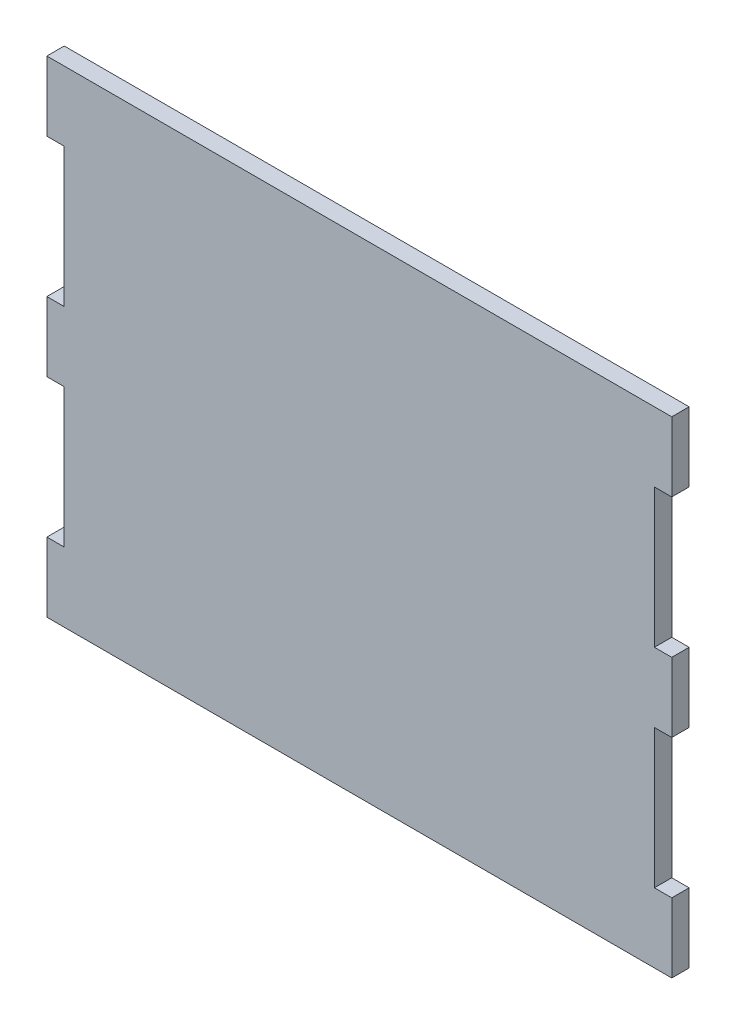
ISO-10303-21;
HEADER;
FILE_DESCRIPTION(('STEP AP214'),'2;1');
FILE_NAME('part.step','',(''),(''),'','','');
FILE_SCHEMA(('AUTOMOTIVE_DESIGN { 1 0 10303 214 1 1 1 1 }'));
ENDSEC;
DATA;
#1=APPLICATION_CONTEXT('core data for automotive mechanical design processes');
#2=APPLICATION_PROTOCOL_DEFINITION('international standard','automotive_design',2000,#1);
#3=PRODUCT_CONTEXT('',#1,'mechanical');
#4=PRODUCT('Part','Part','',(#3));
#5=PRODUCT_RELATED_PRODUCT_CATEGORY('part','',(#4));
#6=PRODUCT_DEFINITION_FORMATION('','',#4);
#7=PRODUCT_DEFINITION_CONTEXT('part definition',#1,'design');
#8=PRODUCT_DEFINITION('design','',#6,#7);
#9=PRODUCT_DEFINITION_SHAPE('','',#8);
#10=(LENGTH_UNIT() NAMED_UNIT(*) SI_UNIT(.MILLI.,.METRE.));
#11=(NAMED_UNIT(*) PLANE_ANGLE_UNIT() SI_UNIT($,.RADIAN.));
#12=(NAMED_UNIT(*) SI_UNIT($,.STERADIAN.) SOLID_ANGLE_UNIT());
#13=UNCERTAINTY_MEASURE_WITH_UNIT(LENGTH_MEASURE(1.E-05),#10,'distance_accuracy_value','');
#14=(GEOMETRIC_REPRESENTATION_CONTEXT(3) GLOBAL_UNCERTAINTY_ASSIGNED_CONTEXT((#13)) GLOBAL_UNIT_ASSIGNED_CONTEXT((#10,
#11,#12)) REPRESENTATION_CONTEXT('',''));
#15=CARTESIAN_POINT('',(0.,0.,0.));
#16=DIRECTION('',(0.,0.,1.));
#17=DIRECTION('',(1.,0.,0.));
#18=AXIS2_PLACEMENT_3D('',#15,#16,#17);
#19=CARTESIAN_POINT('',(0.,0.,5.));
#20=DIRECTION('',(0.,0.,1.));
#21=DIRECTION('',(1.,0.,0.));
#22=AXIS2_PLACEMENT_3D('',#19,#20,#21);
#23=PLANE('',#22);
#24=DIRECTION('',(0.,1.,0.));
#25=VECTOR('',#24,1.);
#26=CARTESIAN_POINT('',(90.,-70.,5.));
#27=LINE('',#26,#25);
#28=CARTESIAN_POINT('',(90.,-10.,5.));
#29=VERTEX_POINT('',#28);
#30=CARTESIAN_POINT('',(90.,10.,5.));
#31=VERTEX_POINT('',#30);
#32=EDGE_CURVE('E298',#29,#31,#27,.T.);
#33=ORIENTED_EDGE('',*,*,#32,.T.);
#34=DIRECTION('',(-1.,0.,0.));
#35=VECTOR('',#34,1.);
#36=CARTESIAN_POINT('',(90.,10.,5.));
#37=LINE('',#36,#35);
#38=CARTESIAN_POINT('',(85.,10.,5.));
#39=VERTEX_POINT('',#38);
#40=EDGE_CURVE('E196',#31,#39,#37,.T.);
#41=ORIENTED_EDGE('',*,*,#40,.T.);
#42=DIRECTION('',(0.,1.,0.));
#43=VECTOR('',#42,1.);
#44=CARTESIAN_POINT('',(85.,50.,5.));
#45=LINE('',#44,#43);
#46=CARTESIAN_POINT('',(85.,50.,5.));
#47=VERTEX_POINT('',#46);
#48=EDGE_CURVE('E199',#39,#47,#45,.T.);
#49=ORIENTED_EDGE('',*,*,#48,.T.);
#50=DIRECTION('',(1.,0.,0.));
#51=VECTOR('',#50,1.);
#52=CARTESIAN_POINT('',(90.,50.,5.));
#53=LINE('',#52,#51);
#54=CARTESIAN_POINT('',(90.,50.,5.));
#55=VERTEX_POINT('',#54);
#56=EDGE_CURVE('E188',#47,#55,#53,.T.);
#57=ORIENTED_EDGE('',*,*,#56,.T.);
#58=CARTESIAN_POINT('',(90.,70.,5.));
#59=VERTEX_POINT('',#58);
#60=EDGE_CURVE('E293',#55,#59,#27,.T.);
#61=ORIENTED_EDGE('',*,*,#60,.T.);
#62=DIRECTION('',(-1.,0.,0.));
#63=VECTOR('',#62,1.);
#64=CARTESIAN_POINT('',(90.,70.,5.));
#65=LINE('',#64,#63);
#66=CARTESIAN_POINT('',(-90.,70.,5.));
#67=VERTEX_POINT('',#66);
#68=EDGE_CURVE('E297',#59,#67,#65,.T.);
#69=ORIENTED_EDGE('',*,*,#68,.T.);
#70=DIRECTION('',(0.,-1.,0.));
#71=VECTOR('',#70,1.);
#72=CARTESIAN_POINT('',(-90.,-70.,5.));
#73=LINE('',#72,#71);
#74=CARTESIAN_POINT('',(-90.,50.,5.));
#75=VERTEX_POINT('',#74);
#76=EDGE_CURVE('E286',#67,#75,#73,.T.);
#77=ORIENTED_EDGE('',*,*,#76,.T.);
#78=DIRECTION('',(-1.,0.,0.));
#79=VECTOR('',#78,1.);
#80=CARTESIAN_POINT('',(-90.,50.,5.));
#81=LINE('',#80,#79);
#82=CARTESIAN_POINT('',(-85.,50.,5.));
#83=VERTEX_POINT('',#82);
#84=EDGE_CURVE('E264',#83,#75,#81,.T.);
#85=ORIENTED_EDGE('',*,*,#84,.F.);
#86=DIRECTION('',(0.,1.,0.));
#87=VECTOR('',#86,1.);
#88=CARTESIAN_POINT('',(-85.,50.,5.));
#89=LINE('',#88,#87);
#90=CARTESIAN_POINT('',(-85.,10.,5.));
#91=VERTEX_POINT('',#90);
#92=EDGE_CURVE('E273',#91,#83,#89,.T.);
#93=ORIENTED_EDGE('',*,*,#92,.F.);
#94=DIRECTION('',(1.,0.,0.));
#95=VECTOR('',#94,1.);
#96=CARTESIAN_POINT('',(-90.,10.,5.));
#97=LINE('',#96,#95);
#98=CARTESIAN_POINT('',(-90.,10.,5.));
#99=VERTEX_POINT('',#98);
#100=EDGE_CURVE('E254',#99,#91,#97,.T.);
#101=ORIENTED_EDGE('',*,*,#100,.F.);
#102=CARTESIAN_POINT('',(-90.,-10.,5.));
#103=VERTEX_POINT('',#102);
#104=EDGE_CURVE('E290',#99,#103,#73,.T.);
#105=ORIENTED_EDGE('',*,*,#104,.T.);
#106=DIRECTION('',(1.,0.,0.));
#107=VECTOR('',#106,1.);
#108=CARTESIAN_POINT('',(-90.,-10.,5.));
#109=LINE('',#108,#107);
#110=CARTESIAN_POINT('',(-85.,-10.,5.));
#111=VERTEX_POINT('',#110);
#112=EDGE_CURVE('E238',#103,#111,#109,.T.);
#113=ORIENTED_EDGE('',*,*,#112,.T.);
#114=DIRECTION('',(0.,-1.,0.));
#115=VECTOR('',#114,1.);
#116=CARTESIAN_POINT('',(-85.,-50.,5.));
#117=LINE('',#116,#115);
#118=CARTESIAN_POINT('',(-85.,-50.,5.));
#119=VERTEX_POINT('',#118);
#120=EDGE_CURVE('E246',#111,#119,#117,.T.);
#121=ORIENTED_EDGE('',*,*,#120,.T.);
#122=DIRECTION('',(-1.,0.,0.));
#123=VECTOR('',#122,1.);
#124=CARTESIAN_POINT('',(-90.,-50.,5.));
#125=LINE('',#124,#123);
#126=CARTESIAN_POINT('',(-90.,-50.,5.));
#127=VERTEX_POINT('',#126);
#128=EDGE_CURVE('E229',#119,#127,#125,.T.);
#129=ORIENTED_EDGE('',*,*,#128,.T.);
#130=CARTESIAN_POINT('',(-90.,-70.,5.));
#131=VERTEX_POINT('',#130);
#132=EDGE_CURVE('E291',#127,#131,#73,.T.);
#133=ORIENTED_EDGE('',*,*,#132,.T.);
#134=DIRECTION('',(1.,0.,0.));
#135=VECTOR('',#134,1.);
#136=CARTESIAN_POINT('',(90.,-70.,5.));
#137=LINE('',#136,#135);
#138=CARTESIAN_POINT('',(90.,-70.,5.));
#139=VERTEX_POINT('',#138);
#140=EDGE_CURVE('E289',#131,#139,#137,.T.);
#141=ORIENTED_EDGE('',*,*,#140,.T.);
#142=CARTESIAN_POINT('',(90.,-50.,5.));
#143=VERTEX_POINT('',#142);
#144=EDGE_CURVE('E294',#139,#143,#27,.T.);
#145=ORIENTED_EDGE('',*,*,#144,.T.);
#146=DIRECTION('',(1.,0.,0.));
#147=VECTOR('',#146,1.);
#148=CARTESIAN_POINT('',(90.,-50.,5.));
#149=LINE('',#148,#147);
#150=CARTESIAN_POINT('',(85.,-50.,5.));
#151=VERTEX_POINT('',#150);
#152=EDGE_CURVE('E213',#151,#143,#149,.T.);
#153=ORIENTED_EDGE('',*,*,#152,.F.);
#154=DIRECTION('',(0.,-1.,0.));
#155=VECTOR('',#154,1.);
#156=CARTESIAN_POINT('',(85.,-50.,5.));
#157=LINE('',#156,#155);
#158=CARTESIAN_POINT('',(85.,-10.,5.));
#159=VERTEX_POINT('',#158);
#160=EDGE_CURVE('E222',#159,#151,#157,.T.);
#161=ORIENTED_EDGE('',*,*,#160,.F.);
#162=DIRECTION('',(-1.,0.,0.));
#163=VECTOR('',#162,1.);
#164=CARTESIAN_POINT('',(90.,-10.,5.));
#165=LINE('',#164,#163);
#166=EDGE_CURVE('E208',#29,#159,#165,.T.);
#167=ORIENTED_EDGE('',*,*,#166,.F.);
#168=EDGE_LOOP('',(#33,#41,#49,#57,#61,#69,#77,#85,#93,#101,#105,#113,#121,#129,#133,#141,#145,
#153,#161,#167));
#169=FACE_BOUND('',#168,.T.);
#170=ADVANCED_FACE('F38',(#169),#23,.T.);
#171=CARTESIAN_POINT('',(0.,0.,0.));
#172=DIRECTION('',(0.,0.,1.));
#173=DIRECTION('',(1.,0.,0.));
#174=AXIS2_PLACEMENT_3D('',#171,#172,#173);
#175=PLANE('',#174);
#176=DIRECTION('',(-1.,0.,0.));
#177=VECTOR('',#176,1.);
#178=CARTESIAN_POINT('',(90.,10.,0.));
#179=LINE('',#178,#177);
#180=CARTESIAN_POINT('',(90.,10.,0.));
#181=VERTEX_POINT('',#180);
#182=CARTESIAN_POINT('',(85.,10.,0.));
#183=VERTEX_POINT('',#182);
#184=EDGE_CURVE('E184',#181,#183,#179,.T.);
#185=ORIENTED_EDGE('',*,*,#184,.F.);
#186=DIRECTION('',(0.,1.,0.));
#187=VECTOR('',#186,1.);
#188=CARTESIAN_POINT('',(90.,-70.,0.));
#189=LINE('',#188,#187);
#190=CARTESIAN_POINT('',(90.,-10.,0.));
#191=VERTEX_POINT('',#190);
#192=EDGE_CURVE('E311',#191,#181,#189,.T.);
#193=ORIENTED_EDGE('',*,*,#192,.F.);
#194=DIRECTION('',(-1.,0.,0.));
#195=VECTOR('',#194,1.);
#196=CARTESIAN_POINT('',(90.,-10.,0.));
#197=LINE('',#196,#195);
#198=CARTESIAN_POINT('',(85.,-10.,0.));
#199=VERTEX_POINT('',#198);
#200=EDGE_CURVE('E61',#191,#199,#197,.T.);
#201=ORIENTED_EDGE('',*,*,#200,.T.);
#202=DIRECTION('',(0.,-1.,0.));
#203=VECTOR('',#202,1.);
#204=CARTESIAN_POINT('',(85.,-50.,0.));
#205=LINE('',#204,#203);
#206=CARTESIAN_POINT('',(85.,-50.,0.));
#207=VERTEX_POINT('',#206);
#208=EDGE_CURVE('E212',#199,#207,#205,.T.);
#209=ORIENTED_EDGE('',*,*,#208,.T.);
#210=DIRECTION('',(1.,0.,0.));
#211=VECTOR('',#210,1.);
#212=CARTESIAN_POINT('',(90.,-50.,0.));
#213=LINE('',#212,#211);
#214=CARTESIAN_POINT('',(90.,-50.,0.));
#215=VERTEX_POINT('',#214);
#216=EDGE_CURVE('E216',#207,#215,#213,.T.);
#217=ORIENTED_EDGE('',*,*,#216,.T.);
#218=CARTESIAN_POINT('',(90.,-70.,0.));
#219=VERTEX_POINT('',#218);
#220=EDGE_CURVE('E307',#219,#215,#189,.T.);
#221=ORIENTED_EDGE('',*,*,#220,.F.);
#222=DIRECTION('',(1.,0.,0.));
#223=VECTOR('',#222,1.);
#224=CARTESIAN_POINT('',(90.,-70.,0.));
#225=LINE('',#224,#223);
#226=CARTESIAN_POINT('',(-90.,-70.,0.));
#227=VERTEX_POINT('',#226);
#228=EDGE_CURVE('E304',#227,#219,#225,.T.);
#229=ORIENTED_EDGE('',*,*,#228,.F.);
#230=DIRECTION('',(0.,-1.,0.));
#231=VECTOR('',#230,1.);
#232=CARTESIAN_POINT('',(-90.,-70.,0.));
#233=LINE('',#232,#231);
#234=CARTESIAN_POINT('',(-90.,-50.,0.));
#235=VERTEX_POINT('',#234);
#236=EDGE_CURVE('E280',#235,#227,#233,.T.);
#237=ORIENTED_EDGE('',*,*,#236,.F.);
#238=DIRECTION('',(-1.,0.,0.));
#239=VECTOR('',#238,1.);
#240=CARTESIAN_POINT('',(-90.,-50.,0.));
#241=LINE('',#240,#239);
#242=CARTESIAN_POINT('',(-85.,-50.,0.));
#243=VERTEX_POINT('',#242);
#244=EDGE_CURVE('E235',#243,#235,#241,.T.);
#245=ORIENTED_EDGE('',*,*,#244,.F.);
#246=DIRECTION('',(0.,-1.,0.));
#247=VECTOR('',#246,1.);
#248=CARTESIAN_POINT('',(-85.,-50.,0.));
#249=LINE('',#248,#247);
#250=CARTESIAN_POINT('',(-85.,-10.,0.));
#251=VERTEX_POINT('',#250);
#252=EDGE_CURVE('E237',#251,#243,#249,.T.);
#253=ORIENTED_EDGE('',*,*,#252,.F.);
#254=DIRECTION('',(1.,0.,0.));
#255=VECTOR('',#254,1.);
#256=CARTESIAN_POINT('',(-90.,-10.,0.));
#257=LINE('',#256,#255);
#258=CARTESIAN_POINT('',(-90.,-10.,0.));
#259=VERTEX_POINT('',#258);
#260=EDGE_CURVE('E241',#259,#251,#257,.T.);
#261=ORIENTED_EDGE('',*,*,#260,.F.);
#262=CARTESIAN_POINT('',(-90.,10.,0.));
#263=VERTEX_POINT('',#262);
#264=EDGE_CURVE('E305',#263,#259,#233,.T.);
#265=ORIENTED_EDGE('',*,*,#264,.F.);
#266=DIRECTION('',(1.,0.,0.));
#267=VECTOR('',#266,1.);
#268=CARTESIAN_POINT('',(-90.,10.,0.));
#269=LINE('',#268,#267);
#270=CARTESIAN_POINT('',(-85.,10.,0.));
#271=VERTEX_POINT('',#270);
#272=EDGE_CURVE('E260',#263,#271,#269,.T.);
#273=ORIENTED_EDGE('',*,*,#272,.T.);
#274=DIRECTION('',(0.,1.,0.));
#275=VECTOR('',#274,1.);
#276=CARTESIAN_POINT('',(-85.,50.,0.));
#277=LINE('',#276,#275);
#278=CARTESIAN_POINT('',(-85.,50.,0.));
#279=VERTEX_POINT('',#278);
#280=EDGE_CURVE('E263',#271,#279,#277,.T.);
#281=ORIENTED_EDGE('',*,*,#280,.T.);
#282=DIRECTION('',(-1.,0.,0.));
#283=VECTOR('',#282,1.);
#284=CARTESIAN_POINT('',(-90.,50.,0.));
#285=LINE('',#284,#283);
#286=CARTESIAN_POINT('',(-90.,50.,0.));
#287=VERTEX_POINT('',#286);
#288=EDGE_CURVE('E267',#279,#287,#285,.T.);
#289=ORIENTED_EDGE('',*,*,#288,.T.);
#290=CARTESIAN_POINT('',(-90.,70.,0.));
#291=VERTEX_POINT('',#290);
#292=EDGE_CURVE('E301',#291,#287,#233,.T.);
#293=ORIENTED_EDGE('',*,*,#292,.F.);
#294=DIRECTION('',(-1.,0.,0.));
#295=VECTOR('',#294,1.);
#296=CARTESIAN_POINT('',(90.,70.,0.));
#297=LINE('',#296,#295);
#298=CARTESIAN_POINT('',(90.,70.,0.));
#299=VERTEX_POINT('',#298);
#300=EDGE_CURVE('E310',#299,#291,#297,.T.);
#301=ORIENTED_EDGE('',*,*,#300,.F.);
#302=CARTESIAN_POINT('',(90.,50.,0.));
#303=VERTEX_POINT('',#302);
#304=EDGE_CURVE('E195',#303,#299,#189,.T.);
#305=ORIENTED_EDGE('',*,*,#304,.F.);
#306=DIRECTION('',(1.,0.,0.));
#307=VECTOR('',#306,1.);
#308=CARTESIAN_POINT('',(90.,50.,0.));
#309=LINE('',#308,#307);
#310=CARTESIAN_POINT('',(85.,50.,0.));
#311=VERTEX_POINT('',#310);
#312=EDGE_CURVE('E53',#311,#303,#309,.T.);
#313=ORIENTED_EDGE('',*,*,#312,.F.);
#314=DIRECTION('',(0.,1.,0.));
#315=VECTOR('',#314,1.);
#316=CARTESIAN_POINT('',(85.,50.,0.));
#317=LINE('',#316,#315);
#318=EDGE_CURVE('E176',#183,#311,#317,.T.);
#319=ORIENTED_EDGE('',*,*,#318,.F.);
#320=EDGE_LOOP('',(#185,#193,#201,#209,#217,#221,#229,#237,#245,#253,#261,#265,#273,#281,#289,
#293,#301,#305,#313,#319));
#321=FACE_BOUND('',#320,.T.);
#322=ADVANCED_FACE('F193',(#321),#175,.F.);
#323=CARTESIAN_POINT('',(90.,-70.,5.));
#324=DIRECTION('',(-1.,0.,0.));
#325=DIRECTION('',(0.,0.,1.));
#326=AXIS2_PLACEMENT_3D('',#323,#324,#325);
#327=PLANE('',#326);
#328=DIRECTION('',(0.,0.,1.));
#329=VECTOR('',#328,1.);
#330=CARTESIAN_POINT('',(90.,10.,0.));
#331=LINE('',#330,#329);
#332=EDGE_CURVE('E205',#181,#31,#331,.T.);
#333=ORIENTED_EDGE('',*,*,#332,.T.);
#334=ORIENTED_EDGE('',*,*,#32,.F.);
#335=DIRECTION('',(0.,0.,1.));
#336=VECTOR('',#335,1.);
#337=CARTESIAN_POINT('',(90.,-10.,0.));
#338=LINE('',#337,#336);
#339=EDGE_CURVE('E219',#191,#29,#338,.T.);
#340=ORIENTED_EDGE('',*,*,#339,.F.);
#341=ORIENTED_EDGE('',*,*,#192,.T.);
#342=EDGE_LOOP('',(#333,#334,#340,#341));
#343=FACE_BOUND('',#342,.T.);
#344=ADVANCED_FACE('F382',(#343),#327,.F.);
#345=DIRECTION('',(0.,0.,1.));
#346=VECTOR('',#345,1.);
#347=CARTESIAN_POINT('',(90.,50.,0.));
#348=LINE('',#347,#346);
#349=EDGE_CURVE('E190',#303,#55,#348,.T.);
#350=ORIENTED_EDGE('',*,*,#349,.F.);
#351=ORIENTED_EDGE('',*,*,#304,.T.);
#352=DIRECTION('',(0.,0.,-1.));
#353=VECTOR('',#352,1.);
#354=CARTESIAN_POINT('',(90.,70.,5.));
#355=LINE('',#354,#353);
#356=EDGE_CURVE('E315',#59,#299,#355,.T.);
#357=ORIENTED_EDGE('',*,*,#356,.F.);
#358=ORIENTED_EDGE('',*,*,#60,.F.);
#359=EDGE_LOOP('',(#350,#351,#357,#358));
#360=FACE_BOUND('',#359,.T.);
#361=ADVANCED_FACE('F378',(#360),#327,.F.);
#362=ORIENTED_EDGE('',*,*,#220,.T.);
#363=DIRECTION('',(0.,0.,1.));
#364=VECTOR('',#363,1.);
#365=CARTESIAN_POINT('',(90.,-50.,0.));
#366=LINE('',#365,#364);
#367=EDGE_CURVE('E226',#215,#143,#366,.T.);
#368=ORIENTED_EDGE('',*,*,#367,.T.);
#369=ORIENTED_EDGE('',*,*,#144,.F.);
#370=DIRECTION('',(0.,0.,-1.));
#371=VECTOR('',#370,1.);
#372=CARTESIAN_POINT('',(90.,-70.,5.));
#373=LINE('',#372,#371);
#374=EDGE_CURVE('E46',#139,#219,#373,.T.);
#375=ORIENTED_EDGE('',*,*,#374,.T.);
#376=EDGE_LOOP('',(#362,#368,#369,#375));
#377=FACE_BOUND('',#376,.T.);
#378=ADVANCED_FACE('F322',(#377),#327,.F.);
#379=CARTESIAN_POINT('',(-90.,-70.,5.));
#380=DIRECTION('',(1.,0.,0.));
#381=DIRECTION('',(0.,0.,-1.));
#382=AXIS2_PLACEMENT_3D('',#379,#380,#381);
#383=PLANE('',#382);
#384=DIRECTION('',(0.,0.,1.));
#385=VECTOR('',#384,1.);
#386=CARTESIAN_POINT('',(-90.,-10.,0.));
#387=LINE('',#386,#385);
#388=EDGE_CURVE('E251',#259,#103,#387,.T.);
#389=ORIENTED_EDGE('',*,*,#388,.T.);
#390=ORIENTED_EDGE('',*,*,#104,.F.);
#391=DIRECTION('',(0.,0.,1.));
#392=VECTOR('',#391,1.);
#393=CARTESIAN_POINT('',(-90.,10.,0.));
#394=LINE('',#393,#392);
#395=EDGE_CURVE('E270',#263,#99,#394,.T.);
#396=ORIENTED_EDGE('',*,*,#395,.F.);
#397=ORIENTED_EDGE('',*,*,#264,.T.);
#398=EDGE_LOOP('',(#389,#390,#396,#397));
#399=FACE_BOUND('',#398,.T.);
#400=ADVANCED_FACE('F40',(#399),#383,.F.);
#401=DIRECTION('',(0.,0.,1.));
#402=VECTOR('',#401,1.);
#403=CARTESIAN_POINT('',(-90.,-50.,0.));
#404=LINE('',#403,#402);
#405=EDGE_CURVE('E243',#235,#127,#404,.T.);
#406=ORIENTED_EDGE('',*,*,#405,.F.);
#407=ORIENTED_EDGE('',*,*,#236,.T.);
#408=DIRECTION('',(0.,0.,-1.));
#409=VECTOR('',#408,1.);
#410=CARTESIAN_POINT('',(-90.,-70.,5.));
#411=LINE('',#410,#409);
#412=EDGE_CURVE('E11',#131,#227,#411,.T.);
#413=ORIENTED_EDGE('',*,*,#412,.F.);
#414=ORIENTED_EDGE('',*,*,#132,.F.);
#415=EDGE_LOOP('',(#406,#407,#413,#414));
#416=FACE_BOUND('',#415,.T.);
#417=ADVANCED_FACE('F340',(#416),#383,.F.);
#418=ORIENTED_EDGE('',*,*,#292,.T.);
#419=DIRECTION('',(0.,0.,1.));
#420=VECTOR('',#419,1.);
#421=CARTESIAN_POINT('',(-90.,50.,0.));
#422=LINE('',#421,#420);
#423=EDGE_CURVE('E277',#287,#75,#422,.T.);
#424=ORIENTED_EDGE('',*,*,#423,.T.);
#425=ORIENTED_EDGE('',*,*,#76,.F.);
#426=DIRECTION('',(0.,0.,-1.));
#427=VECTOR('',#426,1.);
#428=CARTESIAN_POINT('',(-90.,70.,5.));
#429=LINE('',#428,#427);
#430=EDGE_CURVE('E300',#67,#291,#429,.T.);
#431=ORIENTED_EDGE('',*,*,#430,.T.);
#432=EDGE_LOOP('',(#418,#424,#425,#431));
#433=FACE_BOUND('',#432,.T.);
#434=ADVANCED_FACE('F369',(#433),#383,.F.);
#435=CARTESIAN_POINT('',(90.,-70.,5.));
#436=DIRECTION('',(0.,1.,0.));
#437=DIRECTION('',(-1.,0.,0.));
#438=AXIS2_PLACEMENT_3D('',#435,#436,#437);
#439=PLANE('',#438);
#440=ORIENTED_EDGE('',*,*,#228,.T.);
#441=ORIENTED_EDGE('',*,*,#374,.F.);
#442=ORIENTED_EDGE('',*,*,#140,.F.);
#443=ORIENTED_EDGE('',*,*,#412,.T.);
#444=EDGE_LOOP('',(#440,#441,#442,#443));
#445=FACE_BOUND('',#444,.T.);
#446=ADVANCED_FACE('F337',(#445),#439,.F.);
#447=CARTESIAN_POINT('',(90.,70.,5.));
#448=DIRECTION('',(0.,-1.,0.));
#449=DIRECTION('',(1.,0.,0.));
#450=AXIS2_PLACEMENT_3D('',#447,#448,#449);
#451=PLANE('',#450);
#452=ORIENTED_EDGE('',*,*,#300,.T.);
#453=ORIENTED_EDGE('',*,*,#430,.F.);
#454=ORIENTED_EDGE('',*,*,#68,.F.);
#455=ORIENTED_EDGE('',*,*,#356,.T.);
#456=EDGE_LOOP('',(#452,#453,#454,#455));
#457=FACE_BOUND('',#456,.T.);
#458=ADVANCED_FACE('F374',(#457),#451,.F.);
#459=CARTESIAN_POINT('',(-90.,50.,0.));
#460=DIRECTION('',(0.,1.,0.));
#461=DIRECTION('',(0.,0.,1.));
#462=AXIS2_PLACEMENT_3D('',#459,#460,#461);
#463=PLANE('',#462);
#464=ORIENTED_EDGE('',*,*,#84,.T.);
#465=ORIENTED_EDGE('',*,*,#423,.F.);
#466=ORIENTED_EDGE('',*,*,#288,.F.);
#467=DIRECTION('',(0.,0.,1.));
#468=VECTOR('',#467,1.);
#469=CARTESIAN_POINT('',(-85.,50.,0.));
#470=LINE('',#469,#468);
#471=EDGE_CURVE('E281',#279,#83,#470,.T.);
#472=ORIENTED_EDGE('',*,*,#471,.T.);
#473=EDGE_LOOP('',(#464,#465,#466,#472));
#474=FACE_BOUND('',#473,.T.);
#475=ADVANCED_FACE('F387',(#474),#463,.F.);
#476=CARTESIAN_POINT('',(-85.,50.,0.));
#477=DIRECTION('',(1.,0.,0.));
#478=DIRECTION('',(0.,0.,-1.));
#479=AXIS2_PLACEMENT_3D('',#476,#477,#478);
#480=PLANE('',#479);
#481=ORIENTED_EDGE('',*,*,#92,.T.);
#482=ORIENTED_EDGE('',*,*,#471,.F.);
#483=ORIENTED_EDGE('',*,*,#280,.F.);
#484=DIRECTION('',(0.,0.,1.));
#485=VECTOR('',#484,1.);
#486=CARTESIAN_POINT('',(-85.,10.,0.));
#487=LINE('',#486,#485);
#488=EDGE_CURVE('E283',#271,#91,#487,.T.);
#489=ORIENTED_EDGE('',*,*,#488,.T.);
#490=EDGE_LOOP('',(#481,#482,#483,#489));
#491=FACE_BOUND('',#490,.T.);
#492=ADVANCED_FACE('F364',(#491),#480,.F.);
#493=CARTESIAN_POINT('',(-90.,10.,0.));
#494=DIRECTION('',(0.,-1.,0.));
#495=DIRECTION('',(0.,0.,-1.));
#496=AXIS2_PLACEMENT_3D('',#493,#494,#495);
#497=PLANE('',#496);
#498=ORIENTED_EDGE('',*,*,#100,.T.);
#499=ORIENTED_EDGE('',*,*,#488,.F.);
#500=ORIENTED_EDGE('',*,*,#272,.F.);
#501=ORIENTED_EDGE('',*,*,#395,.T.);
#502=EDGE_LOOP('',(#498,#499,#500,#501));
#503=FACE_BOUND('',#502,.T.);
#504=ADVANCED_FACE('F362',(#503),#497,.F.);
#505=CARTESIAN_POINT('',(-90.,-10.,0.));
#506=DIRECTION('',(0.,-1.,0.));
#507=DIRECTION('',(0.,0.,-1.));
#508=AXIS2_PLACEMENT_3D('',#505,#506,#507);
#509=PLANE('',#508);
#510=ORIENTED_EDGE('',*,*,#112,.F.);
#511=ORIENTED_EDGE('',*,*,#388,.F.);
#512=ORIENTED_EDGE('',*,*,#260,.T.);
#513=DIRECTION('',(0.,0.,1.));
#514=VECTOR('',#513,1.);
#515=CARTESIAN_POINT('',(-85.,-10.,0.));
#516=LINE('',#515,#514);
#517=EDGE_CURVE('E255',#251,#111,#516,.T.);
#518=ORIENTED_EDGE('',*,*,#517,.T.);
#519=EDGE_LOOP('',(#510,#511,#512,#518));
#520=FACE_BOUND('',#519,.T.);
#521=ADVANCED_FACE('F352',(#520),#509,.T.);
#522=CARTESIAN_POINT('',(-85.,-50.,0.));
#523=DIRECTION('',(-1.,0.,0.));
#524=DIRECTION('',(0.,0.,1.));
#525=AXIS2_PLACEMENT_3D('',#522,#523,#524);
#526=PLANE('',#525);
#527=ORIENTED_EDGE('',*,*,#120,.F.);
#528=ORIENTED_EDGE('',*,*,#517,.F.);
#529=ORIENTED_EDGE('',*,*,#252,.T.);
#530=DIRECTION('',(0.,0.,1.));
#531=VECTOR('',#530,1.);
#532=CARTESIAN_POINT('',(-85.,-50.,0.));
#533=LINE('',#532,#531);
#534=EDGE_CURVE('E257',#243,#119,#533,.T.);
#535=ORIENTED_EDGE('',*,*,#534,.T.);
#536=EDGE_LOOP('',(#527,#528,#529,#535));
#537=FACE_BOUND('',#536,.T.);
#538=ADVANCED_FACE('F355',(#537),#526,.T.);
#539=CARTESIAN_POINT('',(-90.,-50.,0.));
#540=DIRECTION('',(0.,1.,0.));
#541=DIRECTION('',(0.,0.,1.));
#542=AXIS2_PLACEMENT_3D('',#539,#540,#541);
#543=PLANE('',#542);
#544=ORIENTED_EDGE('',*,*,#128,.F.);
#545=ORIENTED_EDGE('',*,*,#534,.F.);
#546=ORIENTED_EDGE('',*,*,#244,.T.);
#547=ORIENTED_EDGE('',*,*,#405,.T.);
#548=EDGE_LOOP('',(#544,#545,#546,#547));
#549=FACE_BOUND('',#548,.T.);
#550=ADVANCED_FACE('F440',(#549),#543,.T.);
#551=CARTESIAN_POINT('',(90.,-50.,0.));
#552=DIRECTION('',(0.,-1.,0.));
#553=DIRECTION('',(0.,0.,-1.));
#554=AXIS2_PLACEMENT_3D('',#551,#552,#553);
#555=PLANE('',#554);
#556=ORIENTED_EDGE('',*,*,#152,.T.);
#557=ORIENTED_EDGE('',*,*,#367,.F.);
#558=ORIENTED_EDGE('',*,*,#216,.F.);
#559=DIRECTION('',(0.,0.,1.));
#560=VECTOR('',#559,1.);
#561=CARTESIAN_POINT('',(85.,-50.,0.));
#562=LINE('',#561,#560);
#563=EDGE_CURVE('E230',#207,#151,#562,.T.);
#564=ORIENTED_EDGE('',*,*,#563,.T.);
#565=EDGE_LOOP('',(#556,#557,#558,#564));
#566=FACE_BOUND('',#565,.T.);
#567=ADVANCED_FACE('F330',(#566),#555,.F.);
#568=CARTESIAN_POINT('',(85.,-50.,0.));
#569=DIRECTION('',(-1.,0.,0.));
#570=DIRECTION('',(0.,0.,1.));
#571=AXIS2_PLACEMENT_3D('',#568,#569,#570);
#572=PLANE('',#571);
#573=ORIENTED_EDGE('',*,*,#160,.T.);
#574=ORIENTED_EDGE('',*,*,#563,.F.);
#575=ORIENTED_EDGE('',*,*,#208,.F.);
#576=DIRECTION('',(0.,0.,1.));
#577=VECTOR('',#576,1.);
#578=CARTESIAN_POINT('',(85.,-10.,0.));
#579=LINE('',#578,#577);
#580=EDGE_CURVE('E232',#199,#159,#579,.T.);
#581=ORIENTED_EDGE('',*,*,#580,.T.);
#582=EDGE_LOOP('',(#573,#574,#575,#581));
#583=FACE_BOUND('',#582,.T.);
#584=ADVANCED_FACE('F511',(#583),#572,.F.);
#585=CARTESIAN_POINT('',(90.,-10.,0.));
#586=DIRECTION('',(0.,1.,0.));
#587=DIRECTION('',(0.,0.,1.));
#588=AXIS2_PLACEMENT_3D('',#585,#586,#587);
#589=PLANE('',#588);
#590=ORIENTED_EDGE('',*,*,#166,.T.);
#591=ORIENTED_EDGE('',*,*,#580,.F.);
#592=ORIENTED_EDGE('',*,*,#200,.F.);
#593=ORIENTED_EDGE('',*,*,#339,.T.);
#594=EDGE_LOOP('',(#590,#591,#592,#593));
#595=FACE_BOUND('',#594,.T.);
#596=ADVANCED_FACE('F508',(#595),#589,.F.);
#597=CARTESIAN_POINT('',(90.,10.,0.));
#598=DIRECTION('',(0.,1.,0.));
#599=DIRECTION('',(0.,0.,1.));
#600=AXIS2_PLACEMENT_3D('',#597,#598,#599);
#601=PLANE('',#600);
#602=ORIENTED_EDGE('',*,*,#40,.F.);
#603=ORIENTED_EDGE('',*,*,#332,.F.);
#604=ORIENTED_EDGE('',*,*,#184,.T.);
#605=DIRECTION('',(0.,0.,1.));
#606=VECTOR('',#605,1.);
#607=CARTESIAN_POINT('',(85.,10.,0.));
#608=LINE('',#607,#606);
#609=EDGE_CURVE('E181',#183,#39,#608,.T.);
#610=ORIENTED_EDGE('',*,*,#609,.T.);
#611=EDGE_LOOP('',(#602,#603,#604,#610));
#612=FACE_BOUND('',#611,.T.);
#613=ADVANCED_FACE('F385',(#612),#601,.T.);
#614=CARTESIAN_POINT('',(85.,50.,0.));
#615=DIRECTION('',(1.,0.,0.));
#616=DIRECTION('',(0.,0.,-1.));
#617=AXIS2_PLACEMENT_3D('',#614,#615,#616);
#618=PLANE('',#617);
#619=ORIENTED_EDGE('',*,*,#48,.F.);
#620=ORIENTED_EDGE('',*,*,#609,.F.);
#621=ORIENTED_EDGE('',*,*,#318,.T.);
#622=DIRECTION('',(0.,0.,1.));
#623=VECTOR('',#622,1.);
#624=CARTESIAN_POINT('',(85.,50.,0.));
#625=LINE('',#624,#623);
#626=EDGE_CURVE('E179',#311,#47,#625,.T.);
#627=ORIENTED_EDGE('',*,*,#626,.T.);
#628=EDGE_LOOP('',(#619,#620,#621,#627));
#629=FACE_BOUND('',#628,.T.);
#630=ADVANCED_FACE('F178',(#629),#618,.T.);
#631=CARTESIAN_POINT('',(90.,50.,0.));
#632=DIRECTION('',(0.,-1.,0.));
#633=DIRECTION('',(0.,0.,-1.));
#634=AXIS2_PLACEMENT_3D('',#631,#632,#633);
#635=PLANE('',#634);
#636=ORIENTED_EDGE('',*,*,#56,.F.);
#637=ORIENTED_EDGE('',*,*,#626,.F.);
#638=ORIENTED_EDGE('',*,*,#312,.T.);
#639=ORIENTED_EDGE('',*,*,#349,.T.);
#640=EDGE_LOOP('',(#636,#637,#638,#639));
#641=FACE_BOUND('',#640,.T.);
#642=ADVANCED_FACE('F186',(#641),#635,.T.);
#643=CLOSED_SHELL('',(#170,#322,#344,#361,#378,#400,#417,#434,#446,#458,#475,#492,#504,#521,
#538,#550,#567,#584,#596,#613,#630,#642));
#644=MANIFOLD_SOLID_BREP('B2',#643);
#645=ADVANCED_BREP_SHAPE_REPRESENTATION('',(#18,#644),#14);
#646=SHAPE_DEFINITION_REPRESENTATION(#9,#645);
ENDSEC;
END-ISO-10303-21;
